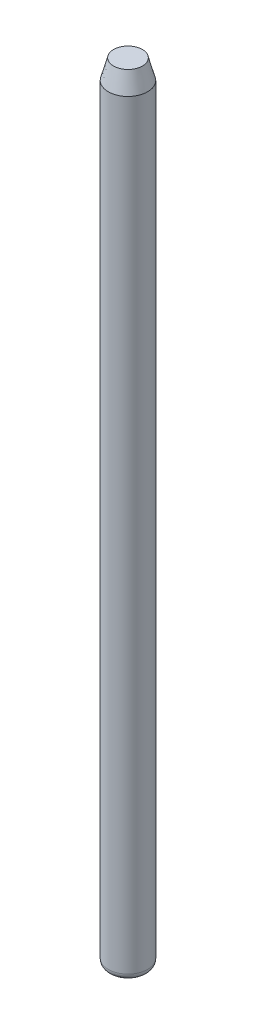
ISO-10303-21;
HEADER;
FILE_DESCRIPTION(('STEP AP214'),'2;1');
FILE_NAME('part.step','',(''),(''),'','','');
FILE_SCHEMA(('AUTOMOTIVE_DESIGN { 1 0 10303 214 1 1 1 1 }'));
ENDSEC;
DATA;
#1=APPLICATION_CONTEXT('core data for automotive mechanical design processes');
#2=APPLICATION_PROTOCOL_DEFINITION('international standard','automotive_design',2000,#1);
#3=PRODUCT_CONTEXT('',#1,'mechanical');
#4=PRODUCT('Part','Part','',(#3));
#5=PRODUCT_RELATED_PRODUCT_CATEGORY('part','',(#4));
#6=PRODUCT_DEFINITION_FORMATION('','',#4);
#7=PRODUCT_DEFINITION_CONTEXT('part definition',#1,'design');
#8=PRODUCT_DEFINITION('design','',#6,#7);
#9=PRODUCT_DEFINITION_SHAPE('','',#8);
#10=(LENGTH_UNIT() NAMED_UNIT(*) SI_UNIT(.MILLI.,.METRE.));
#11=(NAMED_UNIT(*) PLANE_ANGLE_UNIT() SI_UNIT($,.RADIAN.));
#12=(NAMED_UNIT(*) SI_UNIT($,.STERADIAN.) SOLID_ANGLE_UNIT());
#13=UNCERTAINTY_MEASURE_WITH_UNIT(LENGTH_MEASURE(1.E-05),#10,'distance_accuracy_value','');
#14=(GEOMETRIC_REPRESENTATION_CONTEXT(3) GLOBAL_UNCERTAINTY_ASSIGNED_CONTEXT((#13)) GLOBAL_UNIT_ASSIGNED_CONTEXT((#10,
#11,#12)) REPRESENTATION_CONTEXT('',''));
#15=CARTESIAN_POINT('',(0.,0.,0.));
#16=DIRECTION('',(0.,0.,1.));
#17=DIRECTION('',(1.,0.,0.));
#18=AXIS2_PLACEMENT_3D('',#15,#16,#17);
#19=CARTESIAN_POINT('',(0.,60.,0.));
#20=DIRECTION('',(0.,-1.,0.));
#21=DIRECTION('',(0.,0.,-1.));
#22=AXIS2_PLACEMENT_3D('',#19,#20,#21);
#23=CYLINDRICAL_SURFACE('',#22,1.5);
#24=CARTESIAN_POINT('',(0.,0.5,0.));
#25=DIRECTION('',(0.,1.,0.));
#26=DIRECTION('',(0.,0.,1.));
#27=AXIS2_PLACEMENT_3D('',#24,#25,#26);
#28=CIRCLE('',#27,1.5);
#29=CARTESIAN_POINT('',(0.,0.5,1.5));
#30=VERTEX_POINT('',#29);
#31=EDGE_CURVE('E38',#30,#30,#28,.T.);
#32=ORIENTED_EDGE('',*,*,#31,.T.);
#33=EDGE_LOOP('',(#32));
#34=FACE_BOUND('',#33,.T.);
#35=CARTESIAN_POINT('',(0.,58.5,0.));
#36=DIRECTION('',(0.,1.,0.));
#37=DIRECTION('',(0.,0.,1.));
#38=AXIS2_PLACEMENT_3D('',#35,#36,#37);
#39=CIRCLE('',#38,1.5);
#40=CARTESIAN_POINT('',(0.,58.5,1.5));
#41=VERTEX_POINT('',#40);
#42=EDGE_CURVE('E42',#41,#41,#39,.F.);
#43=ORIENTED_EDGE('',*,*,#42,.T.);
#44=EDGE_LOOP('',(#43));
#45=FACE_BOUND('',#44,.T.);
#46=ADVANCED_FACE('F31',(#34,#45),#23,.T.);
#47=CARTESIAN_POINT('',(0.,60.,0.));
#48=DIRECTION('',(0.,1.,0.));
#49=DIRECTION('',(0.,0.,1.));
#50=AXIS2_PLACEMENT_3D('',#47,#48,#49);
#51=PLANE('',#50);
#52=CARTESIAN_POINT('',(0.,60.,0.));
#53=DIRECTION('',(0.,1.,0.));
#54=DIRECTION('',(0.,0.,1.));
#55=AXIS2_PLACEMENT_3D('',#52,#53,#54);
#56=CIRCLE('',#55,1.09807621135331);
#57=CARTESIAN_POINT('',(0.,60.,1.09807621135331));
#58=VERTEX_POINT('',#57);
#59=EDGE_CURVE('E46',#58,#58,#56,.T.);
#60=ORIENTED_EDGE('',*,*,#59,.T.);
#61=EDGE_LOOP('',(#60));
#62=FACE_BOUND('',#61,.T.);
#63=ADVANCED_FACE('F52',(#62),#51,.T.);
#64=CARTESIAN_POINT('',(0.,0.,0.));
#65=DIRECTION('',(0.,1.,0.));
#66=DIRECTION('',(0.,0.,1.));
#67=AXIS2_PLACEMENT_3D('',#64,#65,#66);
#68=PLANE('',#67);
#69=CARTESIAN_POINT('',(0.,0.,0.));
#70=DIRECTION('',(0.,1.,0.));
#71=DIRECTION('',(0.,0.,1.));
#72=AXIS2_PLACEMENT_3D('',#69,#70,#71);
#73=CIRCLE('',#72,1.);
#74=CARTESIAN_POINT('',(0.,0.,1.));
#75=VERTEX_POINT('',#74);
#76=EDGE_CURVE('E10',#75,#75,#73,.F.);
#77=ORIENTED_EDGE('',*,*,#76,.T.);
#78=EDGE_LOOP('',(#77));
#79=FACE_BOUND('',#78,.T.);
#80=ADVANCED_FACE('F56',(#79),#68,.F.);
#81=CARTESIAN_POINT('',(0.,60.,0.));
#82=DIRECTION('',(0.,-1.,0.));
#83=DIRECTION('',(0.,0.,-1.));
#84=AXIS2_PLACEMENT_3D('',#81,#82,#83);
#85=CONICAL_SURFACE('',#84,1.09807621135331,0.261799387799146);
#86=ORIENTED_EDGE('',*,*,#42,.F.);
#87=EDGE_LOOP('',(#86));
#88=FACE_BOUND('',#87,.T.);
#89=ORIENTED_EDGE('',*,*,#59,.F.);
#90=EDGE_LOOP('',(#89));
#91=FACE_BOUND('',#90,.T.);
#92=ADVANCED_FACE('F54',(#88,#91),#85,.T.);
#93=CARTESIAN_POINT('',(0.,0.5,0.));
#94=DIRECTION('',(0.,1.,0.));
#95=DIRECTION('',(0.,0.,1.));
#96=AXIS2_PLACEMENT_3D('',#93,#94,#95);
#97=TOROIDAL_SURFACE('',#96,1.,0.5);
#98=ORIENTED_EDGE('',*,*,#76,.F.);
#99=EDGE_LOOP('',(#98));
#100=FACE_BOUND('',#99,.T.);
#101=ORIENTED_EDGE('',*,*,#31,.F.);
#102=EDGE_LOOP('',(#101));
#103=FACE_BOUND('',#102,.T.);
#104=ADVANCED_FACE('F33',(#100,#103),#97,.T.);
#105=CLOSED_SHELL('',(#46,#63,#80,#92,#104));
#106=MANIFOLD_SOLID_BREP('B2',#105);
#107=ADVANCED_BREP_SHAPE_REPRESENTATION('',(#18,#106),#14);
#108=SHAPE_DEFINITION_REPRESENTATION(#9,#107);
ENDSEC;
END-ISO-10303-21;
